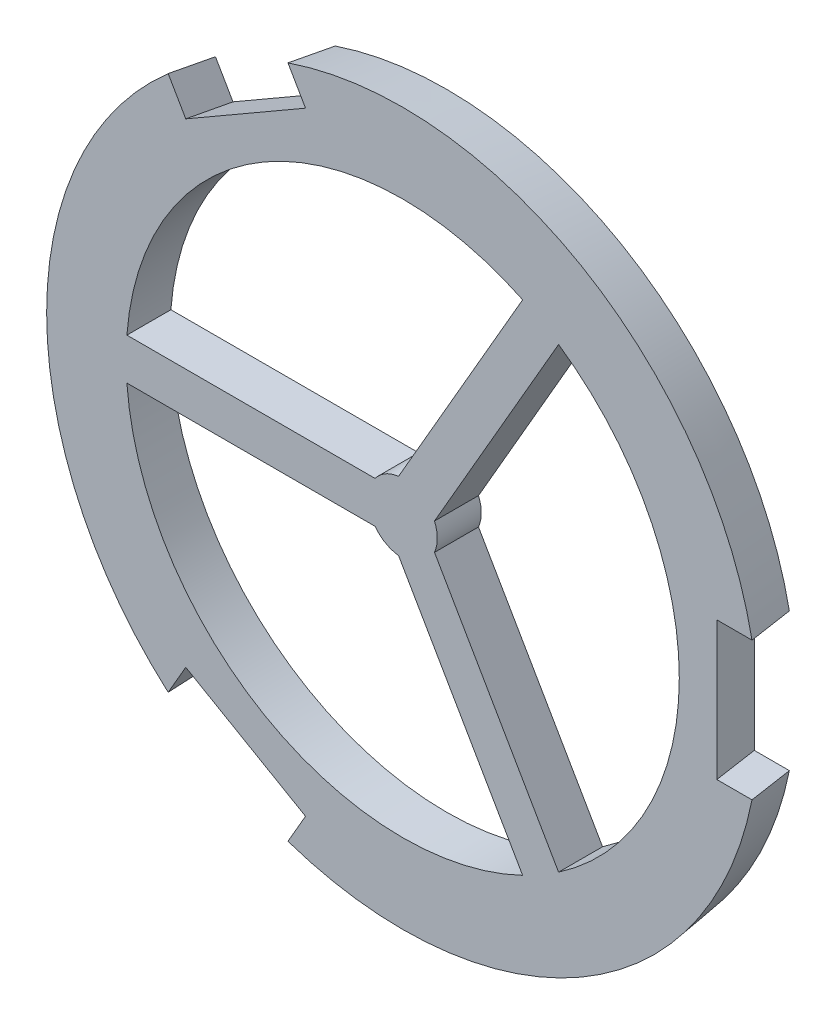
ISO-10303-21;
HEADER;
FILE_DESCRIPTION(('STEP AP214'),'2;1');
FILE_NAME('part.step','',(''),(''),'','','');
FILE_SCHEMA(('AUTOMOTIVE_DESIGN { 1 0 10303 214 1 1 1 1 }'));
ENDSEC;
DATA;
#1=APPLICATION_CONTEXT('core data for automotive mechanical design processes');
#2=APPLICATION_PROTOCOL_DEFINITION('international standard','automotive_design',2000,#1);
#3=PRODUCT_CONTEXT('',#1,'mechanical');
#4=PRODUCT('Part','Part','',(#3));
#5=PRODUCT_RELATED_PRODUCT_CATEGORY('part','',(#4));
#6=PRODUCT_DEFINITION_FORMATION('','',#4);
#7=PRODUCT_DEFINITION_CONTEXT('part definition',#1,'design');
#8=PRODUCT_DEFINITION('design','',#6,#7);
#9=PRODUCT_DEFINITION_SHAPE('','',#8);
#10=(LENGTH_UNIT() NAMED_UNIT(*) SI_UNIT(.MILLI.,.METRE.));
#11=(NAMED_UNIT(*) PLANE_ANGLE_UNIT() SI_UNIT($,.RADIAN.));
#12=(NAMED_UNIT(*) SI_UNIT($,.STERADIAN.) SOLID_ANGLE_UNIT());
#13=UNCERTAINTY_MEASURE_WITH_UNIT(LENGTH_MEASURE(1.E-05),#10,'distance_accuracy_value','');
#14=(GEOMETRIC_REPRESENTATION_CONTEXT(3) GLOBAL_UNCERTAINTY_ASSIGNED_CONTEXT((#13)) GLOBAL_UNIT_ASSIGNED_CONTEXT((#10,
#11,#12)) REPRESENTATION_CONTEXT('',''));
#15=CARTESIAN_POINT('',(0.,0.,0.));
#16=DIRECTION('',(0.,0.,1.));
#17=DIRECTION('',(1.,0.,0.));
#18=AXIS2_PLACEMENT_3D('',#15,#16,#17);
#19=CARTESIAN_POINT('',(0.,0.,205.001597512744));
#20=DIRECTION('',(0.,0.,1.));
#21=DIRECTION('',(1.,0.,0.));
#22=AXIS2_PLACEMENT_3D('',#19,#20,#21);
#23=PLANE('',#22);
#24=CARTESIAN_POINT('',(0.,0.,205.001597512744));
#25=DIRECTION('',(0.,0.,-1.));
#26=DIRECTION('',(-1.,0.,0.));
#27=AXIS2_PLACEMENT_3D('',#24,#25,#26);
#28=CIRCLE('',#27,2.5);
#29=CARTESIAN_POINT('',(-2.00000000000001,1.49999999999999,205.001597512744));
#30=VERTEX_POINT('',#29);
#31=CARTESIAN_POINT('',(-0.299038105676659,2.48205080756888,205.001597512744));
#32=VERTEX_POINT('',#31);
#33=EDGE_CURVE('E111',#30,#32,#28,.T.);
#34=ORIENTED_EDGE('',*,*,#33,.T.);
#35=DIRECTION('',(0.5,0.866025403784439,0.));
#36=VECTOR('',#35,1.);
#37=CARTESIAN_POINT('',(-1.29903810567666,0.75,205.001597512744));
#38=LINE('',#37,#36);
#39=CARTESIAN_POINT('',(8.67279723191291,18.0217254494159,205.001597512744));
#40=VERTEX_POINT('',#39);
#41=EDGE_CURVE('E272',#32,#40,#38,.T.);
#42=ORIENTED_EDGE('',*,*,#41,.T.);
#43=CARTESIAN_POINT('',(0.,0.,205.001597512744));
#44=DIRECTION('',(0.,0.,-1.));
#45=DIRECTION('',(-1.,0.,0.));
#46=AXIS2_PLACEMENT_3D('',#43,#44,#45);
#47=CIRCLE('',#46,20.);
#48=CARTESIAN_POINT('',(-19.9436706751791,1.49999999999993,205.001597512744));
#49=VERTEX_POINT('',#48);
#50=EDGE_CURVE('E256',#49,#40,#47,.T.);
#51=ORIENTED_EDGE('',*,*,#50,.F.);
#52=DIRECTION('',(-1.,0.,0.));
#53=VECTOR('',#52,1.);
#54=CARTESIAN_POINT('',(0.,1.5,205.001597512744));
#55=LINE('',#54,#53);
#56=EDGE_CURVE('E266',#30,#49,#55,.T.);
#57=ORIENTED_EDGE('',*,*,#56,.F.);
#58=EDGE_LOOP('',(#34,#42,#51,#57));
#59=FACE_BOUND('',#58,.T.);
#60=CARTESIAN_POINT('',(0.,0.,205.001597512744));
#61=DIRECTION('',(0.,0.,-1.));
#62=DIRECTION('',(-1.,0.,0.));
#63=AXIS2_PLACEMENT_3D('',#60,#61,#62);
#64=CIRCLE('',#63,25.2769595664034);
#65=CARTESIAN_POINT('',(24.7775036055207,-5.,205.001597512744));
#66=VERTEX_POINT('',#65);
#67=CARTESIAN_POINT('',(-8.05862478383827,-23.9579475647414,205.001597512744));
#68=VERTEX_POINT('',#67);
#69=EDGE_CURVE('E468',#66,#68,#64,.T.);
#70=ORIENTED_EDGE('',*,*,#69,.T.);
#71=DIRECTION('',(0.500000000000004,0.866025403784436,0.));
#72=VECTOR('',#71,1.);
#73=CARTESIAN_POINT('',(4.33012701892218,-2.50000000000002,205.001597512744));
#74=LINE('',#73,#72);
#75=CARTESIAN_POINT('',(-6.7920726735867,-21.7642149593521,205.001597512744));
#76=VERTEX_POINT('',#75);
#77=EDGE_CURVE('E421',#68,#76,#74,.T.);
#78=ORIENTED_EDGE('',*,*,#77,.T.);
#79=DIRECTION('',(0.866025403784436,-0.500000000000004,0.));
#80=VECTOR('',#79,1.);
#81=CARTESIAN_POINT('',(-11.1221996925089,-19.2642149593521,205.001597512744));
#82=LINE('',#81,#80);
#83=CARTESIAN_POINT('',(-15.4523267114311,-16.7642149593521,205.001597512744));
#84=VERTEX_POINT('',#83);
#85=EDGE_CURVE('E424',#84,#76,#82,.T.);
#86=ORIENTED_EDGE('',*,*,#85,.F.);
#87=DIRECTION('',(0.500000000000004,0.866025403784436,0.));
#88=VECTOR('',#87,1.);
#89=CARTESIAN_POINT('',(-4.33012701892218,2.50000000000002,205.001597512744));
#90=LINE('',#89,#88);
#91=CARTESIAN_POINT('',(-16.7188788216826,-18.9579475647414,205.001597512744));
#92=VERTEX_POINT('',#91);
#93=EDGE_CURVE('E401',#92,#84,#90,.T.);
#94=ORIENTED_EDGE('',*,*,#93,.F.);
#95=CARTESIAN_POINT('',(-16.7188788216824,18.9579475647416,205.001597512744));
#96=VERTEX_POINT('',#95);
#97=EDGE_CURVE('E472',#92,#96,#64,.T.);
#98=ORIENTED_EDGE('',*,*,#97,.T.);
#99=DIRECTION('',(0.499999999999992,-0.866025403784443,0.));
#100=VECTOR('',#99,1.);
#101=CARTESIAN_POINT('',(-4.33012701892222,-2.49999999999996,205.001597512744));
#102=LINE('',#101,#100);
#103=CARTESIAN_POINT('',(-15.4523267114308,16.7642149593523,205.001597512744));
#104=VERTEX_POINT('',#103);
#105=EDGE_CURVE('E389',#96,#104,#102,.T.);
#106=ORIENTED_EDGE('',*,*,#105,.T.);
#107=DIRECTION('',(-0.866025403784443,-0.499999999999992,0.));
#108=VECTOR('',#107,1.);
#109=CARTESIAN_POINT('',(-11.1221996925086,19.2642149593523,205.001597512744));
#110=LINE('',#109,#108);
#111=CARTESIAN_POINT('',(-6.79207267358639,21.7642149593522,205.001597512744));
#112=VERTEX_POINT('',#111);
#113=EDGE_CURVE('E392',#112,#104,#110,.T.);
#114=ORIENTED_EDGE('',*,*,#113,.F.);
#115=DIRECTION('',(0.499999999999992,-0.866025403784443,0.));
#116=VECTOR('',#115,1.);
#117=CARTESIAN_POINT('',(4.33012701892222,2.49999999999996,205.001597512744));
#118=LINE('',#117,#116);
#119=CARTESIAN_POINT('',(-8.05862478383793,23.9579475647415,205.001597512744));
#120=VERTEX_POINT('',#119);
#121=EDGE_CURVE('E362',#120,#112,#118,.T.);
#122=ORIENTED_EDGE('',*,*,#121,.F.);
#123=CARTESIAN_POINT('',(24.7775036055207,5.,205.001597512744));
#124=VERTEX_POINT('',#123);
#125=EDGE_CURVE('E466',#120,#124,#64,.T.);
#126=ORIENTED_EDGE('',*,*,#125,.T.);
#127=DIRECTION('',(-1.,0.,0.));
#128=VECTOR('',#127,1.);
#129=CARTESIAN_POINT('',(0.,5.,205.001597512744));
#130=LINE('',#129,#128);
#131=CARTESIAN_POINT('',(22.2443993850176,5.,205.001597512744));
#132=VERTEX_POINT('',#131);
#133=EDGE_CURVE('E457',#124,#132,#130,.T.);
#134=ORIENTED_EDGE('',*,*,#133,.T.);
#135=DIRECTION('',(0.,1.,0.));
#136=VECTOR('',#135,1.);
#137=CARTESIAN_POINT('',(22.2443993850176,0.,205.001597512744));
#138=LINE('',#137,#136);
#139=CARTESIAN_POINT('',(22.2443993850176,-5.,205.001597512744));
#140=VERTEX_POINT('',#139);
#141=EDGE_CURVE('E460',#140,#132,#138,.T.);
#142=ORIENTED_EDGE('',*,*,#141,.F.);
#143=DIRECTION('',(-1.,0.,0.));
#144=VECTOR('',#143,1.);
#145=CARTESIAN_POINT('',(0.,-5.,205.001597512744));
#146=LINE('',#145,#144);
#147=EDGE_CURVE('E437',#66,#140,#146,.T.);
#148=ORIENTED_EDGE('',*,*,#147,.F.);
#149=EDGE_LOOP('',(#70,#78,#86,#94,#98,#106,#114,#122,#126,#134,#142,#148));
#150=FACE_BOUND('',#149,.T.);
#151=CARTESIAN_POINT('',(0.,0.,205.001597512744));
#152=DIRECTION('',(0.,0.,-1.));
#153=DIRECTION('',(-1.,0.,0.));
#154=AXIS2_PLACEMENT_3D('',#151,#152,#153);
#155=CIRCLE('',#154,2.5);
#156=CARTESIAN_POINT('',(2.29903810567665,0.982050807568907,205.001597512744));
#157=VERTEX_POINT('',#156);
#158=CARTESIAN_POINT('',(2.29903810567667,-0.982050807568859,205.001597512744));
#159=VERTEX_POINT('',#158);
#160=EDGE_CURVE('E283',#157,#159,#155,.T.);
#161=ORIENTED_EDGE('',*,*,#160,.T.);
#162=DIRECTION('',(0.500000000000007,-0.866025403784434,0.));
#163=VECTOR('',#162,1.);
#164=CARTESIAN_POINT('',(1.29903810567665,0.750000000000011,205.001597512744));
#165=LINE('',#164,#163);
#166=CARTESIAN_POINT('',(11.2708734432664,-16.5217254494158,205.001597512744));
#167=VERTEX_POINT('',#166);
#168=EDGE_CURVE('E333',#159,#167,#165,.T.);
#169=ORIENTED_EDGE('',*,*,#168,.T.);
#170=CARTESIAN_POINT('',(0.,0.,205.001597512744));
#171=DIRECTION('',(0.,0.,-1.));
#172=DIRECTION('',(-1.,0.,0.));
#173=AXIS2_PLACEMENT_3D('',#170,#171,#172);
#174=CIRCLE('',#173,20.);
#175=CARTESIAN_POINT('',(11.270873443266,16.521725449416,205.001597512744));
#176=VERTEX_POINT('',#175);
#177=EDGE_CURVE('E330',#176,#167,#174,.T.);
#178=ORIENTED_EDGE('',*,*,#177,.F.);
#179=DIRECTION('',(0.499999999999989,0.866025403784445,0.));
#180=VECTOR('',#179,1.);
#181=CARTESIAN_POINT('',(1.29903810567667,-0.749999999999983,205.001597512744));
#182=LINE('',#181,#180);
#183=EDGE_CURVE('E327',#157,#176,#182,.T.);
#184=ORIENTED_EDGE('',*,*,#183,.F.);
#185=EDGE_LOOP('',(#161,#169,#178,#184));
#186=FACE_BOUND('',#185,.T.);
#187=CARTESIAN_POINT('',(0.,0.,205.001597512744));
#188=DIRECTION('',(0.,0.,-1.));
#189=DIRECTION('',(-1.,0.,0.));
#190=AXIS2_PLACEMENT_3D('',#187,#188,#189);
#191=CIRCLE('',#190,2.5);
#192=CARTESIAN_POINT('',(-0.299038105676639,-2.48205080756888,205.001597512744));
#193=VERTEX_POINT('',#192);
#194=CARTESIAN_POINT('',(-2.,-1.50000000000001,205.001597512744));
#195=VERTEX_POINT('',#194);
#196=EDGE_CURVE('E103',#193,#195,#191,.T.);
#197=ORIENTED_EDGE('',*,*,#196,.T.);
#198=DIRECTION('',(-1.,0.,0.));
#199=VECTOR('',#198,1.);
#200=CARTESIAN_POINT('',(0.,-1.5,205.001597512744));
#201=LINE('',#200,#199);
#202=CARTESIAN_POINT('',(-19.9436706751791,-1.50000000000007,205.001597512744));
#203=VERTEX_POINT('',#202);
#204=EDGE_CURVE('E303',#195,#203,#201,.T.);
#205=ORIENTED_EDGE('',*,*,#204,.T.);
#206=CARTESIAN_POINT('',(0.,0.,205.001597512744));
#207=DIRECTION('',(0.,0.,-1.));
#208=DIRECTION('',(-1.,0.,0.));
#209=AXIS2_PLACEMENT_3D('',#206,#207,#208);
#210=CIRCLE('',#209,20.);
#211=CARTESIAN_POINT('',(8.67279723191305,-18.0217254494158,205.001597512744));
#212=VERTEX_POINT('',#211);
#213=EDGE_CURVE('E300',#212,#203,#210,.T.);
#214=ORIENTED_EDGE('',*,*,#213,.F.);
#215=DIRECTION('',(0.500000000000007,-0.866025403784435,0.));
#216=VECTOR('',#215,1.);
#217=CARTESIAN_POINT('',(-1.29903810567665,-0.75000000000001,205.001597512744));
#218=LINE('',#217,#216);
#219=EDGE_CURVE('E297',#193,#212,#218,.T.);
#220=ORIENTED_EDGE('',*,*,#219,.F.);
#221=EDGE_LOOP('',(#197,#205,#214,#220));
#222=FACE_BOUND('',#221,.T.);
#223=ADVANCED_FACE('F89',(#59,#150,#186,#222),#23,.F.);
#224=CARTESIAN_POINT('',(0.,0.,208.182219687359));
#225=DIRECTION('',(0.,0.,-1.));
#226=DIRECTION('',(-1.,0.,0.));
#227=AXIS2_PLACEMENT_3D('',#224,#225,#226);
#228=PLANE('',#227);
#229=CARTESIAN_POINT('',(0.,0.,208.182219687359));
#230=DIRECTION('',(0.,0.,-1.));
#231=DIRECTION('',(-1.,0.,0.));
#232=AXIS2_PLACEMENT_3D('',#229,#230,#231);
#233=CIRCLE('',#232,2.5);
#234=CARTESIAN_POINT('',(-0.299038105676659,2.48205080756888,208.182219687359));
#235=VERTEX_POINT('',#234);
#236=CARTESIAN_POINT('',(-2.00000000000001,1.49999999999999,208.182219687359));
#237=VERTEX_POINT('',#236);
#238=EDGE_CURVE('E284',#235,#237,#233,.F.);
#239=ORIENTED_EDGE('',*,*,#238,.T.);
#240=DIRECTION('',(1.,0.,0.));
#241=VECTOR('',#240,1.);
#242=CARTESIAN_POINT('',(0.,1.5,208.182219687359));
#243=LINE('',#242,#241);
#244=CARTESIAN_POINT('',(-19.9436706751791,1.49999999999993,208.182219687359));
#245=VERTEX_POINT('',#244);
#246=EDGE_CURVE('E281',#245,#237,#243,.T.);
#247=ORIENTED_EDGE('',*,*,#246,.F.);
#248=CARTESIAN_POINT('',(0.,0.,208.182219687359));
#249=DIRECTION('',(0.,0.,-1.));
#250=DIRECTION('',(-1.,0.,0.));
#251=AXIS2_PLACEMENT_3D('',#248,#249,#250);
#252=CIRCLE('',#251,20.);
#253=CARTESIAN_POINT('',(8.67279723191291,18.0217254494159,208.182219687359));
#254=VERTEX_POINT('',#253);
#255=EDGE_CURVE('E259',#254,#245,#252,.F.);
#256=ORIENTED_EDGE('',*,*,#255,.F.);
#257=DIRECTION('',(-0.5,-0.866025403784439,0.));
#258=VECTOR('',#257,1.);
#259=CARTESIAN_POINT('',(-1.29903810567666,0.75,208.182219687359));
#260=LINE('',#259,#258);
#261=EDGE_CURVE('E547',#254,#235,#260,.T.);
#262=ORIENTED_EDGE('',*,*,#261,.T.);
#263=EDGE_LOOP('',(#239,#247,#256,#262));
#264=FACE_BOUND('',#263,.T.);
#265=DIRECTION('',(-0.866025403784436,0.500000000000004,0.));
#266=VECTOR('',#265,1.);
#267=CARTESIAN_POINT('',(-11.3571386684581,-19.6711412023743,208.182219687359));
#268=LINE('',#267,#266);
#269=CARTESIAN_POINT('',(-7.02701164953589,-22.1711412023743,208.182219687359));
#270=VERTEX_POINT('',#269);
#271=CARTESIAN_POINT('',(-15.6872656873803,-17.1711412023743,208.182219687359));
#272=VERTEX_POINT('',#271);
#273=EDGE_CURVE('E96',#270,#272,#268,.T.);
#274=ORIENTED_EDGE('',*,*,#273,.F.);
#275=DIRECTION('',(-0.500000000000004,-0.866025403784436,0.));
#276=VECTOR('',#275,1.);
#277=CARTESIAN_POINT('',(4.33012701892218,-2.50000000000002,208.182219687359));
#278=LINE('',#277,#276);
#279=CARTESIAN_POINT('',(-8.29821058142967,-24.3729223389416,208.182219687359));
#280=VERTEX_POINT('',#279);
#281=EDGE_CURVE('E12',#270,#280,#278,.T.);
#282=ORIENTED_EDGE('',*,*,#281,.T.);
#283=CARTESIAN_POINT('',(0.,0.,208.182219687359));
#284=DIRECTION('',(0.,0.,-1.));
#285=DIRECTION('',(-1.,0.,0.));
#286=AXIS2_PLACEMENT_3D('',#283,#284,#285);
#287=CIRCLE('',#286,25.7468375183018);
#288=CARTESIAN_POINT('',(25.2566752007035,-5.,208.182219687359));
#289=VERTEX_POINT('',#288);
#290=EDGE_CURVE('E463',#289,#280,#287,.T.);
#291=ORIENTED_EDGE('',*,*,#290,.F.);
#292=DIRECTION('',(1.,0.,0.));
#293=VECTOR('',#292,1.);
#294=CARTESIAN_POINT('',(0.,-5.,208.182219687359));
#295=LINE('',#294,#293);
#296=CARTESIAN_POINT('',(22.714277336916,-5.,208.182219687359));
#297=VERTEX_POINT('',#296);
#298=EDGE_CURVE('E471',#297,#289,#295,.T.);
#299=ORIENTED_EDGE('',*,*,#298,.F.);
#300=DIRECTION('',(0.,-1.,0.));
#301=VECTOR('',#300,1.);
#302=CARTESIAN_POINT('',(22.714277336916,0.,208.182219687359));
#303=LINE('',#302,#301);
#304=CARTESIAN_POINT('',(22.714277336916,5.,208.182219687359));
#305=VERTEX_POINT('',#304);
#306=EDGE_CURVE('E474',#305,#297,#303,.T.);
#307=ORIENTED_EDGE('',*,*,#306,.F.);
#308=DIRECTION('',(1.,0.,0.));
#309=VECTOR('',#308,1.);
#310=CARTESIAN_POINT('',(0.,5.,208.182219687359));
#311=LINE('',#310,#309);
#312=CARTESIAN_POINT('',(25.2566752007035,5.,208.182219687359));
#313=VERTEX_POINT('',#312);
#314=EDGE_CURVE('E477',#305,#313,#311,.T.);
#315=ORIENTED_EDGE('',*,*,#314,.T.);
#316=CARTESIAN_POINT('',(-8.29821058142933,24.3729223389417,208.182219687359));
#317=VERTEX_POINT('',#316);
#318=EDGE_CURVE('E462',#317,#313,#287,.T.);
#319=ORIENTED_EDGE('',*,*,#318,.F.);
#320=DIRECTION('',(-0.499999999999992,0.866025403784443,0.));
#321=VECTOR('',#320,1.);
#322=CARTESIAN_POINT('',(4.33012701892222,2.49999999999996,208.182219687359));
#323=LINE('',#322,#321);
#324=CARTESIAN_POINT('',(-7.02701164953558,22.1711412023744,208.182219687359));
#325=VERTEX_POINT('',#324);
#326=EDGE_CURVE('E480',#325,#317,#323,.T.);
#327=ORIENTED_EDGE('',*,*,#326,.F.);
#328=DIRECTION('',(0.866025403784443,0.499999999999992,0.));
#329=VECTOR('',#328,1.);
#330=CARTESIAN_POINT('',(-11.3571386684578,19.6711412023745,208.182219687359));
#331=LINE('',#330,#329);
#332=CARTESIAN_POINT('',(-15.68726568738,17.1711412023745,208.182219687359));
#333=VERTEX_POINT('',#332);
#334=EDGE_CURVE('E482',#333,#325,#331,.T.);
#335=ORIENTED_EDGE('',*,*,#334,.F.);
#336=DIRECTION('',(-0.499999999999992,0.866025403784443,0.));
#337=VECTOR('',#336,1.);
#338=CARTESIAN_POINT('',(-4.33012701892222,-2.49999999999996,208.182219687359));
#339=LINE('',#338,#337);
#340=CARTESIAN_POINT('',(-16.9584646192738,19.3729223389418,208.182219687359));
#341=VERTEX_POINT('',#340);
#342=EDGE_CURVE('E485',#333,#341,#339,.T.);
#343=ORIENTED_EDGE('',*,*,#342,.T.);
#344=CARTESIAN_POINT('',(-16.958464619274,-19.3729223389416,208.182219687359));
#345=VERTEX_POINT('',#344);
#346=EDGE_CURVE('E467',#345,#341,#287,.T.);
#347=ORIENTED_EDGE('',*,*,#346,.F.);
#348=DIRECTION('',(-0.500000000000004,-0.866025403784436,0.));
#349=VECTOR('',#348,1.);
#350=CARTESIAN_POINT('',(-4.33012701892218,2.50000000000002,208.182219687359));
#351=LINE('',#350,#349);
#352=EDGE_CURVE('E488',#272,#345,#351,.T.);
#353=ORIENTED_EDGE('',*,*,#352,.F.);
#354=EDGE_LOOP('',(#274,#282,#291,#299,#307,#315,#319,#327,#335,#343,#347,#353));
#355=FACE_BOUND('',#354,.T.);
#356=CARTESIAN_POINT('',(0.,0.,208.182219687359));
#357=DIRECTION('',(0.,0.,-1.));
#358=DIRECTION('',(-1.,0.,0.));
#359=AXIS2_PLACEMENT_3D('',#356,#357,#358);
#360=CIRCLE('',#359,2.5);
#361=CARTESIAN_POINT('',(2.29903810567667,-0.982050807568859,208.182219687359));
#362=VERTEX_POINT('',#361);
#363=CARTESIAN_POINT('',(2.29903810567665,0.982050807568908,208.182219687359));
#364=VERTEX_POINT('',#363);
#365=EDGE_CURVE('E321',#362,#364,#360,.F.);
#366=ORIENTED_EDGE('',*,*,#365,.T.);
#367=DIRECTION('',(-0.499999999999989,-0.866025403784445,0.));
#368=VECTOR('',#367,1.);
#369=CARTESIAN_POINT('',(1.29903810567667,-0.749999999999983,208.182219687359));
#370=LINE('',#369,#368);
#371=CARTESIAN_POINT('',(11.270873443266,16.521725449416,208.182219687359));
#372=VERTEX_POINT('',#371);
#373=EDGE_CURVE('E324',#372,#364,#370,.T.);
#374=ORIENTED_EDGE('',*,*,#373,.F.);
#375=CARTESIAN_POINT('',(0.,0.,208.182219687359));
#376=DIRECTION('',(0.,0.,-1.));
#377=DIRECTION('',(-1.,0.,0.));
#378=AXIS2_PLACEMENT_3D('',#375,#376,#377);
#379=CIRCLE('',#378,20.);
#380=CARTESIAN_POINT('',(11.2708734432664,-16.5217254494158,208.182219687359));
#381=VERTEX_POINT('',#380);
#382=EDGE_CURVE('E314',#381,#372,#379,.F.);
#383=ORIENTED_EDGE('',*,*,#382,.F.);
#384=DIRECTION('',(-0.500000000000007,0.866025403784435,0.));
#385=VECTOR('',#384,1.);
#386=CARTESIAN_POINT('',(1.29903810567665,0.750000000000011,208.182219687359));
#387=LINE('',#386,#385);
#388=EDGE_CURVE('E317',#381,#362,#387,.T.);
#389=ORIENTED_EDGE('',*,*,#388,.T.);
#390=EDGE_LOOP('',(#366,#374,#383,#389));
#391=FACE_BOUND('',#390,.T.);
#392=CARTESIAN_POINT('',(0.,0.,208.182219687359));
#393=DIRECTION('',(0.,0.,-1.));
#394=DIRECTION('',(-1.,0.,0.));
#395=AXIS2_PLACEMENT_3D('',#392,#393,#394);
#396=CIRCLE('',#395,2.5);
#397=CARTESIAN_POINT('',(-2.,-1.50000000000001,208.182219687359));
#398=VERTEX_POINT('',#397);
#399=CARTESIAN_POINT('',(-0.299038105676638,-2.48205080756888,208.182219687359));
#400=VERTEX_POINT('',#399);
#401=EDGE_CURVE('E292',#398,#400,#396,.F.);
#402=ORIENTED_EDGE('',*,*,#401,.T.);
#403=DIRECTION('',(-0.500000000000007,0.866025403784435,0.));
#404=VECTOR('',#403,1.);
#405=CARTESIAN_POINT('',(-1.29903810567665,-0.75000000000001,208.182219687359));
#406=LINE('',#405,#404);
#407=CARTESIAN_POINT('',(8.67279723191305,-18.0217254494158,208.182219687359));
#408=VERTEX_POINT('',#407);
#409=EDGE_CURVE('E295',#408,#400,#406,.T.);
#410=ORIENTED_EDGE('',*,*,#409,.F.);
#411=CARTESIAN_POINT('',(0.,0.,208.182219687359));
#412=DIRECTION('',(0.,0.,-1.));
#413=DIRECTION('',(-1.,0.,0.));
#414=AXIS2_PLACEMENT_3D('',#411,#412,#413);
#415=CIRCLE('',#414,20.);
#416=CARTESIAN_POINT('',(-19.9436706751791,-1.50000000000007,208.182219687359));
#417=VERTEX_POINT('',#416);
#418=EDGE_CURVE('E285',#417,#408,#415,.F.);
#419=ORIENTED_EDGE('',*,*,#418,.F.);
#420=DIRECTION('',(1.,0.,0.));
#421=VECTOR('',#420,1.);
#422=CARTESIAN_POINT('',(0.,-1.5,208.182219687359));
#423=LINE('',#422,#421);
#424=EDGE_CURVE('E288',#417,#398,#423,.T.);
#425=ORIENTED_EDGE('',*,*,#424,.T.);
#426=EDGE_LOOP('',(#402,#410,#419,#425));
#427=FACE_BOUND('',#426,.T.);
#428=ADVANCED_FACE('F498',(#264,#355,#391,#427),#228,.F.);
#429=CARTESIAN_POINT('',(0.,0.,208.182219687359));
#430=DIRECTION('',(0.,0.,1.));
#431=DIRECTION('',(1.,0.,0.));
#432=AXIS2_PLACEMENT_3D('',#429,#430,#431);
#433=CONICAL_SURFACE('',#432,25.7468375183018,0.14667058989543);
#434=CARTESIAN_POINT('',(-16.9584796791255,-19.3729484233694,208.182419687359));
#435=CARTESIAN_POINT('',(-16.9185580588202,-19.3038021486802,207.652244995823));
#436=CARTESIAN_POINT('',(-16.8786292546359,-19.2346434311476,207.122072468839));
#437=CARTESIAN_POINT('',(-16.798757278509,-19.0963011103948,206.061731743967));
#438=CARTESIAN_POINT('',(-16.7588141065663,-19.0271175071747,205.53156354608));
#439=CARTESIAN_POINT('',(-16.7188637507447,-18.9579214611112,205.001397512744));
#440=B_SPLINE_CURVE_WITH_KNOTS('',3,(#434,#435,#436,#437,#438,#439),.UNSPECIFIED.,.F.,.F.,(4,2,
4),(0.,1.60845929816312,3.21691859634803),.UNSPECIFIED.);
#441=EDGE_CURVE('E394',#345,#92,#440,.T.);
#442=ORIENTED_EDGE('',*,*,#441,.F.);
#443=ORIENTED_EDGE('',*,*,#346,.T.);
#444=CARTESIAN_POINT('',(-16.9584796791252,19.3729484233697,208.182419687359));
#445=CARTESIAN_POINT('',(-16.9185580588199,19.3038021486804,207.652244995823));
#446=CARTESIAN_POINT('',(-16.8786292546356,19.2346434311478,207.122072468839));
#447=CARTESIAN_POINT('',(-16.7987572785087,19.0963011103951,206.061731743967));
#448=CARTESIAN_POINT('',(-16.7588141065661,19.0271175071749,205.53156354608));
#449=CARTESIAN_POINT('',(-16.7188637507445,18.9579214611114,205.001397512744));
#450=B_SPLINE_CURVE_WITH_KNOTS('',3,(#444,#445,#446,#447,#448,#449),.UNSPECIFIED.,.F.,.F.,(4,2,
4),(0.,1.60845929816312,3.21691859634803),.UNSPECIFIED.);
#451=EDGE_CURVE('E382',#341,#96,#450,.T.);
#452=ORIENTED_EDGE('',*,*,#451,.T.);
#453=ORIENTED_EDGE('',*,*,#97,.F.);
#454=EDGE_LOOP('',(#442,#443,#452,#453));
#455=FACE_BOUND('',#454,.T.);
#456=ADVANCED_FACE('F505',(#455),#433,.T.);
#457=CARTESIAN_POINT('',(-8.29822564128078,24.3729484233696,208.182419687359));
#458=CARTESIAN_POINT('',(-8.25830402097546,24.3038021486803,207.652244995823));
#459=CARTESIAN_POINT('',(-8.21837521679121,24.2346434311477,207.122072468839));
#460=CARTESIAN_POINT('',(-8.13850324066429,24.096301110395,206.061731743967));
#461=CARTESIAN_POINT('',(-8.09856006872162,24.0271175071748,205.53156354608));
#462=CARTESIAN_POINT('',(-8.05860971290002,23.9579214611113,205.001397512744));
#463=B_SPLINE_CURVE_WITH_KNOTS('',3,(#457,#458,#459,#460,#461,#462),.UNSPECIFIED.,.F.,.F.,(4,2,
4),(0.,1.60845929816312,3.21691859634803),.UNSPECIFIED.);
#464=EDGE_CURVE('E352',#317,#120,#463,.T.);
#465=ORIENTED_EDGE('',*,*,#464,.F.);
#466=ORIENTED_EDGE('',*,*,#318,.T.);
#467=CARTESIAN_POINT('',(25.9857301870133,5.,213.025833694411));
#468=CARTESIAN_POINT('',(25.6630947154456,5.,210.881121054698));
#469=CARTESIAN_POINT('',(25.3402238007165,5.,208.736443886263));
#470=CARTESIAN_POINT('',(24.6940110846455,5.,204.447160490023));
#471=CARTESIAN_POINT('',(24.3706692833032,5.,202.302554262218));
#472=CARTESIAN_POINT('',(24.0470920387991,5.,200.157983505692));
#473=B_SPLINE_CURVE_WITH_KNOTS('',3,(#467,#468,#469,#470,#471,#472),.UNSPECIFIED.,.F.,.F.,(4,2,
4),(0.,6.50653302915344,13.0130660641502),.UNSPECIFIED.);
#474=EDGE_CURVE('E450',#313,#124,#473,.T.);
#475=ORIENTED_EDGE('',*,*,#474,.T.);
#476=ORIENTED_EDGE('',*,*,#125,.F.);
#477=EDGE_LOOP('',(#465,#466,#475,#476));
#478=FACE_BOUND('',#477,.T.);
#479=ADVANCED_FACE('F517',(#478),#433,.T.);
#480=ORIENTED_EDGE('',*,*,#290,.T.);
#481=CARTESIAN_POINT('',(-8.29822564128112,-24.3729484233695,208.182419687359));
#482=CARTESIAN_POINT('',(-8.2583040209758,-24.3038021486802,207.652244995823));
#483=CARTESIAN_POINT('',(-8.21837521679155,-24.2346434311476,207.122072468839));
#484=CARTESIAN_POINT('',(-8.13850324066463,-24.0963011103949,206.061731743967));
#485=CARTESIAN_POINT('',(-8.09856006872196,-24.0271175071747,205.53156354608));
#486=CARTESIAN_POINT('',(-8.05860971290035,-23.9579214611112,205.001397512744));
#487=B_SPLINE_CURVE_WITH_KNOTS('',3,(#481,#482,#483,#484,#485,#486),.UNSPECIFIED.,.F.,.F.,(4,2,
4),(0.,1.60845929816312,3.21691859634803),.UNSPECIFIED.);
#488=EDGE_CURVE('E414',#280,#68,#487,.T.);
#489=ORIENTED_EDGE('',*,*,#488,.T.);
#490=ORIENTED_EDGE('',*,*,#69,.F.);
#491=CARTESIAN_POINT('',(25.9857301870133,-5.,213.025833694411));
#492=CARTESIAN_POINT('',(25.6630947154456,-5.,210.881121054698));
#493=CARTESIAN_POINT('',(25.3402238007165,-5.,208.736443886263));
#494=CARTESIAN_POINT('',(24.6940110846455,-5.,204.447160490023));
#495=CARTESIAN_POINT('',(24.3706692833032,-5.,202.302554262218));
#496=CARTESIAN_POINT('',(24.0470920387991,-5.,200.157983505692));
#497=B_SPLINE_CURVE_WITH_KNOTS('',3,(#491,#492,#493,#494,#495,#496),.UNSPECIFIED.,.F.,.F.,(4,2,
4),(0.,6.50653302915344,13.0130660641502),.UNSPECIFIED.);
#498=EDGE_CURVE('E431',#289,#66,#497,.T.);
#499=ORIENTED_EDGE('',*,*,#498,.F.);
#500=EDGE_LOOP('',(#480,#489,#490,#499));
#501=FACE_BOUND('',#500,.T.);
#502=ADVANCED_FACE('F364',(#501),#433,.T.);
#503=CARTESIAN_POINT('',(22.0941259465987,5.,203.984390749669));
#504=DIRECTION('',(0.989263137600486,0.,-0.146145285879642));
#505=DIRECTION('',(-0.146145285879642,0.,-0.989263137600486));
#506=AXIS2_PLACEMENT_3D('',#503,#504,#505);
#507=PLANE('',#506);
#508=ORIENTED_EDGE('',*,*,#141,.T.);
#509=DIRECTION('',(0.146145285879642,0.,0.989263137600486));
#510=VECTOR('',#509,1.);
#511=CARTESIAN_POINT('',(22.0941259465987,5.,203.984390749669));
#512=LINE('',#511,#510);
#513=EDGE_CURVE('E428',#132,#305,#512,.T.);
#514=ORIENTED_EDGE('',*,*,#513,.T.);
#515=ORIENTED_EDGE('',*,*,#306,.T.);
#516=DIRECTION('',(0.146145285879642,0.,0.989263137600486));
#517=VECTOR('',#516,1.);
#518=CARTESIAN_POINT('',(22.0941259465987,-5.,203.984390749669));
#519=LINE('',#518,#517);
#520=EDGE_CURVE('E426',#140,#297,#519,.T.);
#521=ORIENTED_EDGE('',*,*,#520,.F.);
#522=EDGE_LOOP('',(#508,#514,#515,#521));
#523=FACE_BOUND('',#522,.T.);
#524=ADVANCED_FACE('F448',(#523),#507,.T.);
#525=CARTESIAN_POINT('',(0.,5.,0.));
#526=DIRECTION('',(0.,1.,0.));
#527=DIRECTION('',(0.,0.,1.));
#528=AXIS2_PLACEMENT_3D('',#525,#526,#527);
#529=PLANE('',#528);
#530=ORIENTED_EDGE('',*,*,#474,.F.);
#531=ORIENTED_EDGE('',*,*,#314,.F.);
#532=ORIENTED_EDGE('',*,*,#513,.F.);
#533=ORIENTED_EDGE('',*,*,#133,.F.);
#534=EDGE_LOOP('',(#530,#531,#532,#533));
#535=FACE_BOUND('',#534,.T.);
#536=ADVANCED_FACE('F443',(#535),#529,.F.);
#537=CARTESIAN_POINT('',(0.,-5.,0.));
#538=DIRECTION('',(0.,1.,0.));
#539=DIRECTION('',(0.,0.,1.));
#540=AXIS2_PLACEMENT_3D('',#537,#538,#539);
#541=PLANE('',#540);
#542=ORIENTED_EDGE('',*,*,#147,.T.);
#543=ORIENTED_EDGE('',*,*,#520,.T.);
#544=ORIENTED_EDGE('',*,*,#298,.T.);
#545=ORIENTED_EDGE('',*,*,#498,.T.);
#546=EDGE_LOOP('',(#542,#543,#544,#545));
#547=FACE_BOUND('',#546,.T.);
#548=ADVANCED_FACE('F439',(#547),#541,.T.);
#549=CARTESIAN_POINT('',(-15.3771899922214,16.6340743441675,203.984390749669));
#550=DIRECTION('',(-0.494631568800235,0.856727008189526,-0.146145285879642));
#551=DIRECTION('',(-0.866025403784443,-0.499999999999992,0.));
#552=AXIS2_PLACEMENT_3D('',#549,#550,#551);
#553=PLANE('',#552);
#554=ORIENTED_EDGE('',*,*,#113,.T.);
#555=DIRECTION('',(-0.0730726429398197,0.12656553021511,0.989263137600486));
#556=VECTOR('',#555,1.);
#557=CARTESIAN_POINT('',(-15.3771899922214,16.6340743441675,203.984390749669));
#558=LINE('',#557,#556);
#559=EDGE_CURVE('E349',#104,#333,#558,.T.);
#560=ORIENTED_EDGE('',*,*,#559,.T.);
#561=ORIENTED_EDGE('',*,*,#334,.T.);
#562=DIRECTION('',(-0.0730726429398197,0.12656553021511,0.989263137600486));
#563=VECTOR('',#562,1.);
#564=CARTESIAN_POINT('',(-6.71693595437696,21.6340743441675,203.984390749669));
#565=LINE('',#564,#563);
#566=EDGE_CURVE('E345',#112,#325,#565,.T.);
#567=ORIENTED_EDGE('',*,*,#566,.F.);
#568=EDGE_LOOP('',(#554,#560,#561,#567));
#569=FACE_BOUND('',#568,.T.);
#570=ADVANCED_FACE('F379',(#569),#553,.T.);
#571=CARTESIAN_POINT('',(-4.33012701892222,-2.49999999999996,0.));
#572=DIRECTION('',(-0.866025403784443,-0.499999999999992,0.));
#573=DIRECTION('',(0.,0.,1.));
#574=AXIS2_PLACEMENT_3D('',#571,#572,#573);
#575=PLANE('',#574);
#576=ORIENTED_EDGE('',*,*,#451,.F.);
#577=ORIENTED_EDGE('',*,*,#342,.F.);
#578=ORIENTED_EDGE('',*,*,#559,.F.);
#579=ORIENTED_EDGE('',*,*,#105,.F.);
#580=EDGE_LOOP('',(#576,#577,#578,#579));
#581=FACE_BOUND('',#580,.T.);
#582=ADVANCED_FACE('F373',(#581),#575,.F.);
#583=CARTESIAN_POINT('',(4.33012701892222,2.49999999999996,0.));
#584=DIRECTION('',(-0.866025403784443,-0.499999999999992,0.));
#585=DIRECTION('',(0.,0.,1.));
#586=AXIS2_PLACEMENT_3D('',#583,#584,#585);
#587=PLANE('',#586);
#588=ORIENTED_EDGE('',*,*,#121,.T.);
#589=ORIENTED_EDGE('',*,*,#566,.T.);
#590=ORIENTED_EDGE('',*,*,#326,.T.);
#591=ORIENTED_EDGE('',*,*,#464,.T.);
#592=EDGE_LOOP('',(#588,#589,#590,#591));
#593=FACE_BOUND('',#592,.T.);
#594=ADVANCED_FACE('F367',(#593),#587,.T.);
#595=CARTESIAN_POINT('',(-6.71693595437726,-21.6340743441674,203.984390749669));
#596=DIRECTION('',(-0.494631568800247,-0.856727008189519,-0.146145285879642));
#597=DIRECTION('',(0.866025403784436,-0.500000000000004,0.));
#598=AXIS2_PLACEMENT_3D('',#595,#596,#597);
#599=PLANE('',#598);
#600=ORIENTED_EDGE('',*,*,#85,.T.);
#601=DIRECTION('',(-0.0730726429398215,-0.126565530215109,0.989263137600486));
#602=VECTOR('',#601,1.);
#603=CARTESIAN_POINT('',(-6.71693595437726,-21.6340743441674,203.984390749669));
#604=LINE('',#603,#602);
#605=EDGE_CURVE('E348',#76,#270,#604,.T.);
#606=ORIENTED_EDGE('',*,*,#605,.T.);
#607=ORIENTED_EDGE('',*,*,#273,.T.);
#608=DIRECTION('',(-0.0730726429398215,-0.126565530215109,0.989263137600486));
#609=VECTOR('',#608,1.);
#610=CARTESIAN_POINT('',(-15.3771899922216,-16.6340743441673,203.984390749669));
#611=LINE('',#610,#609);
#612=EDGE_CURVE('E346',#84,#272,#611,.T.);
#613=ORIENTED_EDGE('',*,*,#612,.F.);
#614=EDGE_LOOP('',(#600,#606,#607,#613));
#615=FACE_BOUND('',#614,.T.);
#616=ADVANCED_FACE('F372',(#615),#599,.T.);
#617=CARTESIAN_POINT('',(4.33012701892218,-2.50000000000002,0.));
#618=DIRECTION('',(0.866025403784436,-0.500000000000004,0.));
#619=DIRECTION('',(0.,0.,1.));
#620=AXIS2_PLACEMENT_3D('',#617,#618,#619);
#621=PLANE('',#620);
#622=ORIENTED_EDGE('',*,*,#488,.F.);
#623=ORIENTED_EDGE('',*,*,#281,.F.);
#624=ORIENTED_EDGE('',*,*,#605,.F.);
#625=ORIENTED_EDGE('',*,*,#77,.F.);
#626=EDGE_LOOP('',(#622,#623,#624,#625));
#627=FACE_BOUND('',#626,.T.);
#628=ADVANCED_FACE('F408',(#627),#621,.F.);
#629=CARTESIAN_POINT('',(-4.33012701892218,2.50000000000002,0.));
#630=DIRECTION('',(0.866025403784436,-0.500000000000004,0.));
#631=DIRECTION('',(0.,0.,1.));
#632=AXIS2_PLACEMENT_3D('',#629,#630,#631);
#633=PLANE('',#632);
#634=ORIENTED_EDGE('',*,*,#93,.T.);
#635=ORIENTED_EDGE('',*,*,#612,.T.);
#636=ORIENTED_EDGE('',*,*,#352,.T.);
#637=ORIENTED_EDGE('',*,*,#441,.T.);
#638=EDGE_LOOP('',(#634,#635,#636,#637));
#639=FACE_BOUND('',#638,.T.);
#640=ADVANCED_FACE('F403',(#639),#633,.T.);
#641=CARTESIAN_POINT('',(0.,0.,245.668133032078));
#642=DIRECTION('',(0.,0.,-1.));
#643=DIRECTION('',(-1.,0.,0.));
#644=AXIS2_PLACEMENT_3D('',#641,#642,#643);
#645=CYLINDRICAL_SURFACE('',#644,2.5);
#646=DIRECTION('',(0.,0.,-1.));
#647=VECTOR('',#646,1.);
#648=CARTESIAN_POINT('',(2.29903810567667,-0.982050807568859,245.668133032078));
#649=LINE('',#648,#647);
#650=EDGE_CURVE('E318',#362,#159,#649,.T.);
#651=ORIENTED_EDGE('',*,*,#650,.T.);
#652=ORIENTED_EDGE('',*,*,#160,.F.);
#653=DIRECTION('',(0.,0.,-1.));
#654=VECTOR('',#653,1.);
#655=CARTESIAN_POINT('',(2.29903810567665,0.982050807568907,245.668133032078));
#656=LINE('',#655,#654);
#657=EDGE_CURVE('E336',#364,#157,#656,.T.);
#658=ORIENTED_EDGE('',*,*,#657,.F.);
#659=ORIENTED_EDGE('',*,*,#365,.F.);
#660=EDGE_LOOP('',(#651,#652,#658,#659));
#661=FACE_BOUND('',#660,.T.);
#662=ADVANCED_FACE('F407',(#661),#645,.T.);
#663=CARTESIAN_POINT('',(1.29903810567665,0.750000000000011,245.668133032078));
#664=DIRECTION('',(0.866025403784435,0.500000000000007,0.));
#665=DIRECTION('',(-0.500000000000007,0.866025403784435,0.));
#666=AXIS2_PLACEMENT_3D('',#663,#664,#665);
#667=PLANE('',#666);
#668=DIRECTION('',(0.,0.,-1.));
#669=VECTOR('',#668,1.);
#670=CARTESIAN_POINT('',(11.2708734432664,-16.5217254494158,245.668133032078));
#671=LINE('',#670,#669);
#672=EDGE_CURVE('E338',#381,#167,#671,.T.);
#673=ORIENTED_EDGE('',*,*,#672,.T.);
#674=ORIENTED_EDGE('',*,*,#168,.F.);
#675=ORIENTED_EDGE('',*,*,#650,.F.);
#676=ORIENTED_EDGE('',*,*,#388,.F.);
#677=EDGE_LOOP('',(#673,#674,#675,#676));
#678=FACE_BOUND('',#677,.T.);
#679=ADVANCED_FACE('F582',(#678),#667,.T.);
#680=CARTESIAN_POINT('',(0.,0.,245.668133032078));
#681=DIRECTION('',(0.,0.,-1.));
#682=DIRECTION('',(-1.,0.,0.));
#683=AXIS2_PLACEMENT_3D('',#680,#681,#682);
#684=CYLINDRICAL_SURFACE('',#683,20.);
#685=ORIENTED_EDGE('',*,*,#382,.T.);
#686=DIRECTION('',(0.,0.,-1.));
#687=VECTOR('',#686,1.);
#688=CARTESIAN_POINT('',(11.270873443266,16.521725449416,245.668133032078));
#689=LINE('',#688,#687);
#690=EDGE_CURVE('E340',#372,#176,#689,.T.);
#691=ORIENTED_EDGE('',*,*,#690,.T.);
#692=ORIENTED_EDGE('',*,*,#177,.T.);
#693=ORIENTED_EDGE('',*,*,#672,.F.);
#694=EDGE_LOOP('',(#685,#691,#692,#693));
#695=FACE_BOUND('',#694,.T.);
#696=ADVANCED_FACE('F585',(#695),#684,.F.);
#697=CARTESIAN_POINT('',(1.29903810567667,-0.749999999999983,245.668133032078));
#698=DIRECTION('',(-0.866025403784445,0.499999999999989,0.));
#699=DIRECTION('',(-0.499999999999989,-0.866025403784445,0.));
#700=AXIS2_PLACEMENT_3D('',#697,#698,#699);
#701=PLANE('',#700);
#702=ORIENTED_EDGE('',*,*,#373,.T.);
#703=ORIENTED_EDGE('',*,*,#657,.T.);
#704=ORIENTED_EDGE('',*,*,#183,.T.);
#705=ORIENTED_EDGE('',*,*,#690,.F.);
#706=EDGE_LOOP('',(#702,#703,#704,#705));
#707=FACE_BOUND('',#706,.T.);
#708=ADVANCED_FACE('F562',(#707),#701,.F.);
#709=CARTESIAN_POINT('',(0.,0.,245.668133032078));
#710=DIRECTION('',(0.,0.,-1.));
#711=DIRECTION('',(-1.,0.,0.));
#712=AXIS2_PLACEMENT_3D('',#709,#710,#711);
#713=CYLINDRICAL_SURFACE('',#712,2.5);
#714=DIRECTION('',(0.,0.,-1.));
#715=VECTOR('',#714,1.);
#716=CARTESIAN_POINT('',(-0.299038105676659,2.48205080756888,245.668133032078));
#717=LINE('',#716,#715);
#718=EDGE_CURVE('E277',#235,#32,#717,.T.);
#719=ORIENTED_EDGE('',*,*,#718,.T.);
#720=ORIENTED_EDGE('',*,*,#33,.F.);
#721=DIRECTION('',(0.,0.,-1.));
#722=VECTOR('',#721,1.);
#723=CARTESIAN_POINT('',(-2.00000000000001,1.49999999999999,245.668133032078));
#724=LINE('',#723,#722);
#725=EDGE_CURVE('E263',#237,#30,#724,.T.);
#726=ORIENTED_EDGE('',*,*,#725,.F.);
#727=ORIENTED_EDGE('',*,*,#238,.F.);
#728=EDGE_LOOP('',(#719,#720,#726,#727));
#729=FACE_BOUND('',#728,.T.);
#730=ADVANCED_FACE('F552',(#729),#713,.T.);
#731=CARTESIAN_POINT('',(-1.29903810567666,0.75,245.668133032078));
#732=DIRECTION('',(-0.866025403784439,0.5,0.));
#733=DIRECTION('',(-0.5,-0.866025403784439,0.));
#734=AXIS2_PLACEMENT_3D('',#731,#732,#733);
#735=PLANE('',#734);
#736=DIRECTION('',(0.,0.,-1.));
#737=VECTOR('',#736,1.);
#738=CARTESIAN_POINT('',(8.67279723191291,18.0217254494159,245.668133032078));
#739=LINE('',#738,#737);
#740=EDGE_CURVE('E262',#254,#40,#739,.T.);
#741=ORIENTED_EDGE('',*,*,#740,.T.);
#742=ORIENTED_EDGE('',*,*,#41,.F.);
#743=ORIENTED_EDGE('',*,*,#718,.F.);
#744=ORIENTED_EDGE('',*,*,#261,.F.);
#745=EDGE_LOOP('',(#741,#742,#743,#744));
#746=FACE_BOUND('',#745,.T.);
#747=ADVANCED_FACE('F554',(#746),#735,.T.);
#748=CARTESIAN_POINT('',(0.,0.,245.668133032078));
#749=DIRECTION('',(0.,0.,-1.));
#750=DIRECTION('',(-1.,0.,0.));
#751=AXIS2_PLACEMENT_3D('',#748,#749,#750);
#752=CYLINDRICAL_SURFACE('',#751,20.);
#753=ORIENTED_EDGE('',*,*,#255,.T.);
#754=DIRECTION('',(0.,0.,-1.));
#755=VECTOR('',#754,1.);
#756=CARTESIAN_POINT('',(-19.9436706751791,1.49999999999993,245.668133032078));
#757=LINE('',#756,#755);
#758=EDGE_CURVE('E251',#245,#49,#757,.T.);
#759=ORIENTED_EDGE('',*,*,#758,.T.);
#760=ORIENTED_EDGE('',*,*,#50,.T.);
#761=ORIENTED_EDGE('',*,*,#740,.F.);
#762=EDGE_LOOP('',(#753,#759,#760,#761));
#763=FACE_BOUND('',#762,.T.);
#764=ADVANCED_FACE('F253',(#763),#752,.F.);
#765=CARTESIAN_POINT('',(0.,1.5,245.668133032078));
#766=DIRECTION('',(0.,-1.,0.));
#767=DIRECTION('',(1.,0.,0.));
#768=AXIS2_PLACEMENT_3D('',#765,#766,#767);
#769=PLANE('',#768);
#770=ORIENTED_EDGE('',*,*,#246,.T.);
#771=ORIENTED_EDGE('',*,*,#725,.T.);
#772=ORIENTED_EDGE('',*,*,#56,.T.);
#773=ORIENTED_EDGE('',*,*,#758,.F.);
#774=EDGE_LOOP('',(#770,#771,#772,#773));
#775=FACE_BOUND('',#774,.T.);
#776=ADVANCED_FACE('F267',(#775),#769,.F.);
#777=CARTESIAN_POINT('',(0.,0.,245.668133032078));
#778=DIRECTION('',(0.,0.,-1.));
#779=DIRECTION('',(-1.,0.,0.));
#780=AXIS2_PLACEMENT_3D('',#777,#778,#779);
#781=CYLINDRICAL_SURFACE('',#780,2.5);
#782=DIRECTION('',(0.,0.,-1.));
#783=VECTOR('',#782,1.);
#784=CARTESIAN_POINT('',(-2.,-1.50000000000001,245.668133032078));
#785=LINE('',#784,#783);
#786=EDGE_CURVE('E289',#398,#195,#785,.T.);
#787=ORIENTED_EDGE('',*,*,#786,.T.);
#788=ORIENTED_EDGE('',*,*,#196,.F.);
#789=DIRECTION('',(0.,0.,-1.));
#790=VECTOR('',#789,1.);
#791=CARTESIAN_POINT('',(-0.299038105676639,-2.48205080756888,245.668133032078));
#792=LINE('',#791,#790);
#793=EDGE_CURVE('E306',#400,#193,#792,.T.);
#794=ORIENTED_EDGE('',*,*,#793,.F.);
#795=ORIENTED_EDGE('',*,*,#401,.F.);
#796=EDGE_LOOP('',(#787,#788,#794,#795));
#797=FACE_BOUND('',#796,.T.);
#798=ADVANCED_FACE('F566',(#797),#781,.T.);
#799=CARTESIAN_POINT('',(0.,-1.5,245.668133032078));
#800=DIRECTION('',(0.,-1.,0.));
#801=DIRECTION('',(1.,0.,0.));
#802=AXIS2_PLACEMENT_3D('',#799,#800,#801);
#803=PLANE('',#802);
#804=DIRECTION('',(0.,0.,-1.));
#805=VECTOR('',#804,1.);
#806=CARTESIAN_POINT('',(-19.9436706751791,-1.50000000000007,245.668133032078));
#807=LINE('',#806,#805);
#808=EDGE_CURVE('E308',#417,#203,#807,.T.);
#809=ORIENTED_EDGE('',*,*,#808,.T.);
#810=ORIENTED_EDGE('',*,*,#204,.F.);
#811=ORIENTED_EDGE('',*,*,#786,.F.);
#812=ORIENTED_EDGE('',*,*,#424,.F.);
#813=EDGE_LOOP('',(#809,#810,#811,#812));
#814=FACE_BOUND('',#813,.T.);
#815=ADVANCED_FACE('F568',(#814),#803,.T.);
#816=CARTESIAN_POINT('',(0.,0.,245.668133032078));
#817=DIRECTION('',(0.,0.,-1.));
#818=DIRECTION('',(-1.,0.,0.));
#819=AXIS2_PLACEMENT_3D('',#816,#817,#818);
#820=CYLINDRICAL_SURFACE('',#819,20.);
#821=ORIENTED_EDGE('',*,*,#418,.T.);
#822=DIRECTION('',(0.,0.,-1.));
#823=VECTOR('',#822,1.);
#824=CARTESIAN_POINT('',(8.67279723191305,-18.0217254494158,245.668133032078));
#825=LINE('',#824,#823);
#826=EDGE_CURVE('E310',#408,#212,#825,.T.);
#827=ORIENTED_EDGE('',*,*,#826,.T.);
#828=ORIENTED_EDGE('',*,*,#213,.T.);
#829=ORIENTED_EDGE('',*,*,#808,.F.);
#830=EDGE_LOOP('',(#821,#827,#828,#829));
#831=FACE_BOUND('',#830,.T.);
#832=ADVANCED_FACE('F571',(#831),#820,.F.);
#833=CARTESIAN_POINT('',(-1.29903810567665,-0.75000000000001,245.668133032078));
#834=DIRECTION('',(0.866025403784435,0.500000000000007,0.));
#835=DIRECTION('',(-0.500000000000007,0.866025403784435,0.));
#836=AXIS2_PLACEMENT_3D('',#833,#834,#835);
#837=PLANE('',#836);
#838=ORIENTED_EDGE('',*,*,#409,.T.);
#839=ORIENTED_EDGE('',*,*,#793,.T.);
#840=ORIENTED_EDGE('',*,*,#219,.T.);
#841=ORIENTED_EDGE('',*,*,#826,.F.);
#842=EDGE_LOOP('',(#838,#839,#840,#841));
#843=FACE_BOUND('',#842,.T.);
#844=ADVANCED_FACE('F575',(#843),#837,.F.);
#845=CLOSED_SHELL('',(#223,#428,#456,#479,#502,#524,#536,#548,#570,#582,#594,#616,#628,#640,
#662,#679,#696,#708,#730,#747,#764,#776,#798,#815,#832,#844));
#846=MANIFOLD_SOLID_BREP('B2',#845);
#847=ADVANCED_BREP_SHAPE_REPRESENTATION('',(#18,#846),#14);
#848=SHAPE_DEFINITION_REPRESENTATION(#9,#847);
ENDSEC;
END-ISO-10303-21;
